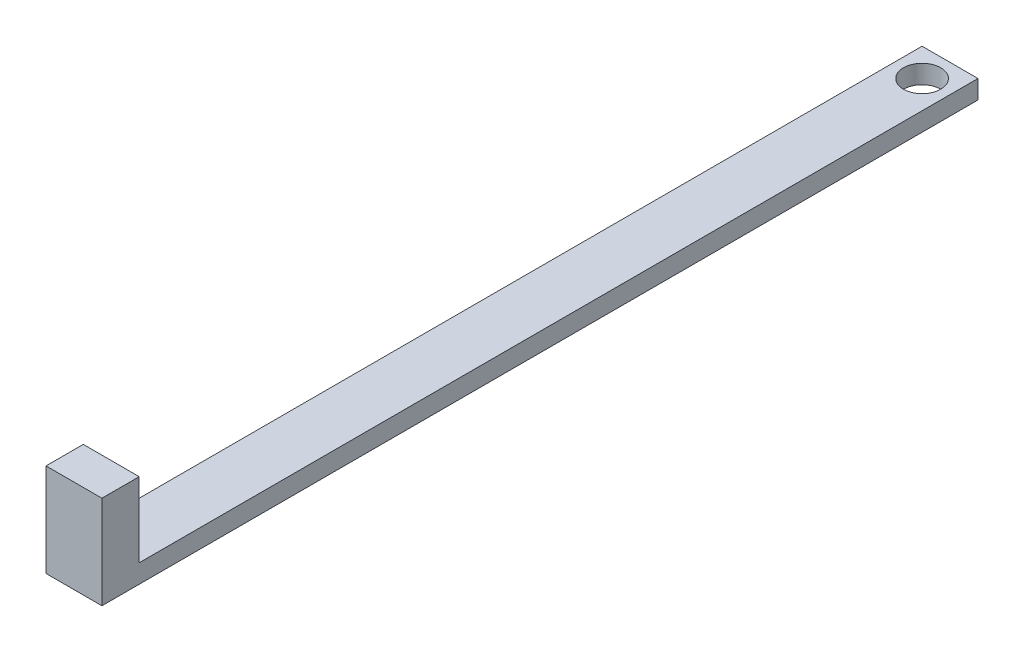
ISO-10303-21;
HEADER;
FILE_DESCRIPTION(('STEP AP214'),'2;1');
FILE_NAME('part.step','',(''),(''),'','','');
FILE_SCHEMA(('AUTOMOTIVE_DESIGN { 1 0 10303 214 1 1 1 1 }'));
ENDSEC;
DATA;
#1=APPLICATION_CONTEXT('core data for automotive mechanical design processes');
#2=APPLICATION_PROTOCOL_DEFINITION('international standard','automotive_design',2000,#1);
#3=PRODUCT_CONTEXT('',#1,'mechanical');
#4=PRODUCT('Part','Part','',(#3));
#5=PRODUCT_RELATED_PRODUCT_CATEGORY('part','',(#4));
#6=PRODUCT_DEFINITION_FORMATION('','',#4);
#7=PRODUCT_DEFINITION_CONTEXT('part definition',#1,'design');
#8=PRODUCT_DEFINITION('design','',#6,#7);
#9=PRODUCT_DEFINITION_SHAPE('','',#8);
#10=(LENGTH_UNIT() NAMED_UNIT(*) SI_UNIT(.MILLI.,.METRE.));
#11=(NAMED_UNIT(*) PLANE_ANGLE_UNIT() SI_UNIT($,.RADIAN.));
#12=(NAMED_UNIT(*) SI_UNIT($,.STERADIAN.) SOLID_ANGLE_UNIT());
#13=UNCERTAINTY_MEASURE_WITH_UNIT(LENGTH_MEASURE(1.E-05),#10,'distance_accuracy_value','');
#14=(GEOMETRIC_REPRESENTATION_CONTEXT(3) GLOBAL_UNCERTAINTY_ASSIGNED_CONTEXT((#13)) GLOBAL_UNIT_ASSIGNED_CONTEXT((#10,
#11,#12)) REPRESENTATION_CONTEXT('',''));
#15=CARTESIAN_POINT('',(0.,0.,0.));
#16=DIRECTION('',(0.,0.,1.));
#17=DIRECTION('',(1.,0.,0.));
#18=AXIS2_PLACEMENT_3D('',#15,#16,#17);
#19=CARTESIAN_POINT('',(30.,0.,0.));
#20=DIRECTION('',(0.,-1.,0.));
#21=DIRECTION('',(0.,0.,-1.));
#22=AXIS2_PLACEMENT_3D('',#19,#20,#21);
#23=PLANE('',#22);
#24=CARTESIAN_POINT('',(15.,0.,-435.));
#25=DIRECTION('',(0.,1.,0.));
#26=DIRECTION('',(0.,0.,1.));
#27=AXIS2_PLACEMENT_3D('',#24,#25,#26);
#28=CIRCLE('',#27,10.);
#29=CARTESIAN_POINT('',(15.,0.,-425.));
#30=VERTEX_POINT('',#29);
#31=EDGE_CURVE('E182',#30,#30,#28,.T.);
#32=ORIENTED_EDGE('',*,*,#31,.F.);
#33=EDGE_LOOP('',(#32));
#34=FACE_BOUND('',#33,.T.);
#35=DIRECTION('',(0.,0.,1.));
#36=VECTOR('',#35,1.);
#37=CARTESIAN_POINT('',(0.,0.,0.));
#38=LINE('',#37,#36);
#39=CARTESIAN_POINT('',(0.,0.,-450.));
#40=VERTEX_POINT('',#39);
#41=CARTESIAN_POINT('',(0.,0.,0.));
#42=VERTEX_POINT('',#41);
#43=EDGE_CURVE('E127',#40,#42,#38,.T.);
#44=ORIENTED_EDGE('',*,*,#43,.T.);
#45=DIRECTION('',(-1.,0.,0.));
#46=VECTOR('',#45,1.);
#47=CARTESIAN_POINT('',(30.,0.,0.));
#48=LINE('',#47,#46);
#49=CARTESIAN_POINT('',(30.,0.,0.));
#50=VERTEX_POINT('',#49);
#51=EDGE_CURVE('E11',#50,#42,#48,.T.);
#52=ORIENTED_EDGE('',*,*,#51,.F.);
#53=DIRECTION('',(0.,0.,1.));
#54=VECTOR('',#53,1.);
#55=CARTESIAN_POINT('',(30.,0.,0.));
#56=LINE('',#55,#54);
#57=CARTESIAN_POINT('',(30.,0.,-450.));
#58=VERTEX_POINT('',#57);
#59=EDGE_CURVE('E144',#58,#50,#56,.T.);
#60=ORIENTED_EDGE('',*,*,#59,.F.);
#61=DIRECTION('',(-1.,0.,0.));
#62=VECTOR('',#61,1.);
#63=CARTESIAN_POINT('',(30.,0.,-450.));
#64=LINE('',#63,#62);
#65=EDGE_CURVE('E123',#58,#40,#64,.T.);
#66=ORIENTED_EDGE('',*,*,#65,.T.);
#67=EDGE_LOOP('',(#44,#52,#60,#66));
#68=FACE_BOUND('',#67,.T.);
#69=ADVANCED_FACE('F38',(#34,#68),#23,.F.);
#70=CARTESIAN_POINT('',(30.,40.,0.));
#71=DIRECTION('',(0.,0.,1.));
#72=DIRECTION('',(0.,-1.,0.));
#73=AXIS2_PLACEMENT_3D('',#70,#71,#72);
#74=PLANE('',#73);
#75=DIRECTION('',(0.,1.,0.));
#76=VECTOR('',#75,1.);
#77=CARTESIAN_POINT('',(0.,40.,0.));
#78=LINE('',#77,#76);
#79=CARTESIAN_POINT('',(0.,40.,0.));
#80=VERTEX_POINT('',#79);
#81=EDGE_CURVE('E131',#42,#80,#78,.T.);
#82=ORIENTED_EDGE('',*,*,#81,.T.);
#83=DIRECTION('',(-1.,0.,0.));
#84=VECTOR('',#83,1.);
#85=CARTESIAN_POINT('',(30.,40.,0.));
#86=LINE('',#85,#84);
#87=CARTESIAN_POINT('',(30.,40.,0.));
#88=VERTEX_POINT('',#87);
#89=EDGE_CURVE('E47',#88,#80,#86,.T.);
#90=ORIENTED_EDGE('',*,*,#89,.F.);
#91=DIRECTION('',(0.,1.,0.));
#92=VECTOR('',#91,1.);
#93=CARTESIAN_POINT('',(30.,40.,0.));
#94=LINE('',#93,#92);
#95=EDGE_CURVE('E92',#50,#88,#94,.T.);
#96=ORIENTED_EDGE('',*,*,#95,.F.);
#97=ORIENTED_EDGE('',*,*,#51,.T.);
#98=EDGE_LOOP('',(#82,#90,#96,#97));
#99=FACE_BOUND('',#98,.T.);
#100=ADVANCED_FACE('F174',(#99),#74,.F.);
#101=CARTESIAN_POINT('',(30.,40.,20.));
#102=DIRECTION('',(0.,-1.,0.));
#103=DIRECTION('',(0.,0.,-1.));
#104=AXIS2_PLACEMENT_3D('',#101,#102,#103);
#105=PLANE('',#104);
#106=DIRECTION('',(0.,0.,1.));
#107=VECTOR('',#106,1.);
#108=CARTESIAN_POINT('',(0.,40.,20.));
#109=LINE('',#108,#107);
#110=CARTESIAN_POINT('',(0.,40.,20.));
#111=VERTEX_POINT('',#110);
#112=EDGE_CURVE('E135',#80,#111,#109,.T.);
#113=ORIENTED_EDGE('',*,*,#112,.T.);
#114=DIRECTION('',(-1.,0.,0.));
#115=VECTOR('',#114,1.);
#116=CARTESIAN_POINT('',(30.,40.,20.));
#117=LINE('',#116,#115);
#118=CARTESIAN_POINT('',(30.,40.,20.));
#119=VERTEX_POINT('',#118);
#120=EDGE_CURVE('E116',#119,#111,#117,.T.);
#121=ORIENTED_EDGE('',*,*,#120,.F.);
#122=DIRECTION('',(0.,0.,1.));
#123=VECTOR('',#122,1.);
#124=CARTESIAN_POINT('',(30.,40.,20.));
#125=LINE('',#124,#123);
#126=EDGE_CURVE('E105',#88,#119,#125,.T.);
#127=ORIENTED_EDGE('',*,*,#126,.F.);
#128=ORIENTED_EDGE('',*,*,#89,.T.);
#129=EDGE_LOOP('',(#113,#121,#127,#128));
#130=FACE_BOUND('',#129,.T.);
#131=ADVANCED_FACE('F154',(#130),#105,.F.);
#132=CARTESIAN_POINT('',(30.,-10.0000000000001,20.));
#133=DIRECTION('',(0.,0.,-1.));
#134=DIRECTION('',(-1.,0.,0.));
#135=AXIS2_PLACEMENT_3D('',#132,#133,#134);
#136=PLANE('',#135);
#137=DIRECTION('',(0.,-1.,0.));
#138=VECTOR('',#137,1.);
#139=CARTESIAN_POINT('',(0.,-10.0000000000001,20.));
#140=LINE('',#139,#138);
#141=CARTESIAN_POINT('',(0.,-10.0000000000001,20.));
#142=VERTEX_POINT('',#141);
#143=EDGE_CURVE('E114',#111,#142,#140,.T.);
#144=ORIENTED_EDGE('',*,*,#143,.T.);
#145=DIRECTION('',(-1.,0.,0.));
#146=VECTOR('',#145,1.);
#147=CARTESIAN_POINT('',(30.,-10.0000000000001,20.));
#148=LINE('',#147,#146);
#149=CARTESIAN_POINT('',(30.,-10.0000000000001,20.));
#150=VERTEX_POINT('',#149);
#151=EDGE_CURVE('E111',#150,#142,#148,.T.);
#152=ORIENTED_EDGE('',*,*,#151,.F.);
#153=DIRECTION('',(0.,-1.,0.));
#154=VECTOR('',#153,1.);
#155=CARTESIAN_POINT('',(30.,-10.0000000000001,20.));
#156=LINE('',#155,#154);
#157=EDGE_CURVE('E99',#119,#150,#156,.T.);
#158=ORIENTED_EDGE('',*,*,#157,.F.);
#159=ORIENTED_EDGE('',*,*,#120,.T.);
#160=EDGE_LOOP('',(#144,#152,#158,#159));
#161=FACE_BOUND('',#160,.T.);
#162=ADVANCED_FACE('F112',(#161),#136,.F.);
#163=CARTESIAN_POINT('',(30.,-10.,-450.));
#164=DIRECTION('',(0.,1.,0.));
#165=DIRECTION('',(0.,0.,1.));
#166=AXIS2_PLACEMENT_3D('',#163,#164,#165);
#167=PLANE('',#166);
#168=CARTESIAN_POINT('',(15.,-10.,-435.));
#169=DIRECTION('',(0.,1.,0.));
#170=DIRECTION('',(0.,0.,1.));
#171=AXIS2_PLACEMENT_3D('',#168,#169,#170);
#172=CIRCLE('',#171,10.);
#173=CARTESIAN_POINT('',(15.,-10.,-425.));
#174=VERTEX_POINT('',#173);
#175=EDGE_CURVE('E132',#174,#174,#172,.T.);
#176=ORIENTED_EDGE('',*,*,#175,.T.);
#177=EDGE_LOOP('',(#176));
#178=FACE_BOUND('',#177,.T.);
#179=DIRECTION('',(0.,0.,-1.));
#180=VECTOR('',#179,1.);
#181=CARTESIAN_POINT('',(0.,-10.,-450.));
#182=LINE('',#181,#180);
#183=CARTESIAN_POINT('',(0.,-10.,-450.));
#184=VERTEX_POINT('',#183);
#185=EDGE_CURVE('E78',#142,#184,#182,.T.);
#186=ORIENTED_EDGE('',*,*,#185,.T.);
#187=DIRECTION('',(-1.,0.,0.));
#188=VECTOR('',#187,1.);
#189=CARTESIAN_POINT('',(30.,-10.,-450.));
#190=LINE('',#189,#188);
#191=CARTESIAN_POINT('',(30.,-10.,-450.));
#192=VERTEX_POINT('',#191);
#193=EDGE_CURVE('E117',#192,#184,#190,.T.);
#194=ORIENTED_EDGE('',*,*,#193,.F.);
#195=DIRECTION('',(0.,0.,-1.));
#196=VECTOR('',#195,1.);
#197=CARTESIAN_POINT('',(30.,-10.,-450.));
#198=LINE('',#197,#196);
#199=EDGE_CURVE('E103',#150,#192,#198,.T.);
#200=ORIENTED_EDGE('',*,*,#199,.F.);
#201=ORIENTED_EDGE('',*,*,#151,.T.);
#202=EDGE_LOOP('',(#186,#194,#200,#201));
#203=FACE_BOUND('',#202,.T.);
#204=ADVANCED_FACE('F119',(#178,#203),#167,.F.);
#205=CARTESIAN_POINT('',(30.,0.,-450.));
#206=DIRECTION('',(0.,0.,1.));
#207=DIRECTION('',(1.,0.,0.));
#208=AXIS2_PLACEMENT_3D('',#205,#206,#207);
#209=PLANE('',#208);
#210=DIRECTION('',(0.,1.,0.));
#211=VECTOR('',#210,1.);
#212=CARTESIAN_POINT('',(0.,0.,-450.));
#213=LINE('',#212,#211);
#214=EDGE_CURVE('E84',#184,#40,#213,.T.);
#215=ORIENTED_EDGE('',*,*,#214,.T.);
#216=ORIENTED_EDGE('',*,*,#65,.F.);
#217=DIRECTION('',(0.,1.,0.));
#218=VECTOR('',#217,1.);
#219=CARTESIAN_POINT('',(30.,0.,-450.));
#220=LINE('',#219,#218);
#221=EDGE_CURVE('E55',#192,#58,#220,.T.);
#222=ORIENTED_EDGE('',*,*,#221,.F.);
#223=ORIENTED_EDGE('',*,*,#193,.T.);
#224=EDGE_LOOP('',(#215,#216,#222,#223));
#225=FACE_BOUND('',#224,.T.);
#226=ADVANCED_FACE('F161',(#225),#209,.F.);
#227=CARTESIAN_POINT('',(30.,0.,0.));
#228=DIRECTION('',(-1.,0.,0.));
#229=DIRECTION('',(0.,0.,1.));
#230=AXIS2_PLACEMENT_3D('',#227,#228,#229);
#231=PLANE('',#230);
#232=ORIENTED_EDGE('',*,*,#59,.T.);
#233=ORIENTED_EDGE('',*,*,#95,.T.);
#234=ORIENTED_EDGE('',*,*,#126,.T.);
#235=ORIENTED_EDGE('',*,*,#157,.T.);
#236=ORIENTED_EDGE('',*,*,#199,.T.);
#237=ORIENTED_EDGE('',*,*,#221,.T.);
#238=EDGE_LOOP('',(#232,#233,#234,#235,#236,#237));
#239=FACE_BOUND('',#238,.T.);
#240=ADVANCED_FACE('F101',(#239),#231,.F.);
#241=CARTESIAN_POINT('',(0.,0.,0.));
#242=DIRECTION('',(-1.,0.,0.));
#243=DIRECTION('',(0.,0.,1.));
#244=AXIS2_PLACEMENT_3D('',#241,#242,#243);
#245=PLANE('',#244);
#246=ORIENTED_EDGE('',*,*,#43,.F.);
#247=ORIENTED_EDGE('',*,*,#214,.F.);
#248=ORIENTED_EDGE('',*,*,#185,.F.);
#249=ORIENTED_EDGE('',*,*,#143,.F.);
#250=ORIENTED_EDGE('',*,*,#112,.F.);
#251=ORIENTED_EDGE('',*,*,#81,.F.);
#252=EDGE_LOOP('',(#246,#247,#248,#249,#250,#251));
#253=FACE_BOUND('',#252,.T.);
#254=ADVANCED_FACE('F157',(#253),#245,.T.);
#255=CARTESIAN_POINT('',(15.,-10.,-435.));
#256=DIRECTION('',(0.,1.,0.));
#257=DIRECTION('',(0.,0.,1.));
#258=AXIS2_PLACEMENT_3D('',#255,#256,#257);
#259=CYLINDRICAL_SURFACE('',#258,10.);
#260=ORIENTED_EDGE('',*,*,#175,.F.);
#261=EDGE_LOOP('',(#260));
#262=FACE_BOUND('',#261,.T.);
#263=ORIENTED_EDGE('',*,*,#31,.T.);
#264=EDGE_LOOP('',(#263));
#265=FACE_BOUND('',#264,.T.);
#266=ADVANCED_FACE('F196',(#262,#265),#259,.F.);
#267=CLOSED_SHELL('',(#69,#100,#131,#162,#204,#226,#240,#254,#266));
#268=MANIFOLD_SOLID_BREP('B2',#267);
#269=ADVANCED_BREP_SHAPE_REPRESENTATION('',(#18,#268),#14);
#270=SHAPE_DEFINITION_REPRESENTATION(#9,#269);
ENDSEC;
END-ISO-10303-21;
